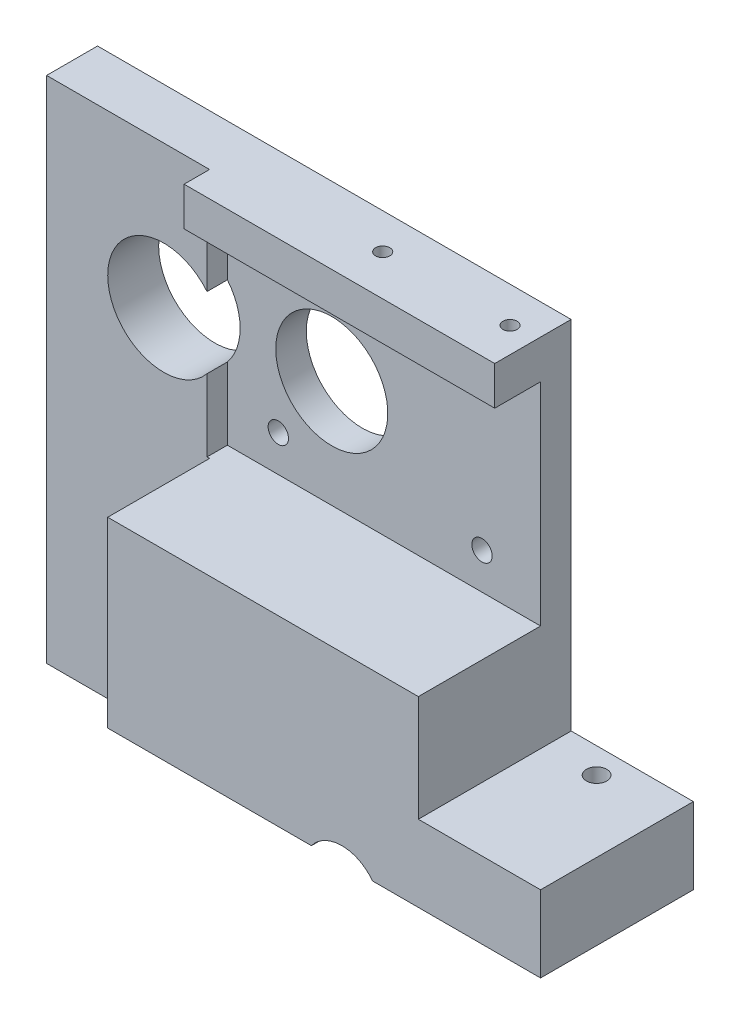
ISO-10303-21;
HEADER;
FILE_DESCRIPTION(('STEP AP214'),'2;1');
FILE_NAME('part.step','',(''),(''),'','','');
FILE_SCHEMA(('AUTOMOTIVE_DESIGN { 1 0 10303 214 1 1 1 1 }'));
ENDSEC;
DATA;
#1=APPLICATION_CONTEXT('core data for automotive mechanical design processes');
#2=APPLICATION_PROTOCOL_DEFINITION('international standard','automotive_design',2000,#1);
#3=PRODUCT_CONTEXT('',#1,'mechanical');
#4=PRODUCT('Part','Part','',(#3));
#5=PRODUCT_RELATED_PRODUCT_CATEGORY('part','',(#4));
#6=PRODUCT_DEFINITION_FORMATION('','',#4);
#7=PRODUCT_DEFINITION_CONTEXT('part definition',#1,'design');
#8=PRODUCT_DEFINITION('design','',#6,#7);
#9=PRODUCT_DEFINITION_SHAPE('','',#8);
#10=(LENGTH_UNIT() NAMED_UNIT(*) SI_UNIT(.MILLI.,.METRE.));
#11=(NAMED_UNIT(*) PLANE_ANGLE_UNIT() SI_UNIT($,.RADIAN.));
#12=(NAMED_UNIT(*) SI_UNIT($,.STERADIAN.) SOLID_ANGLE_UNIT());
#13=UNCERTAINTY_MEASURE_WITH_UNIT(LENGTH_MEASURE(1.E-05),#10,'distance_accuracy_value','');
#14=(GEOMETRIC_REPRESENTATION_CONTEXT(3) GLOBAL_UNCERTAINTY_ASSIGNED_CONTEXT((#13)) GLOBAL_UNIT_ASSIGNED_CONTEXT((#10,
#11,#12)) REPRESENTATION_CONTEXT('',''));
#15=CARTESIAN_POINT('',(0.,0.,0.));
#16=DIRECTION('',(0.,0.,1.));
#17=DIRECTION('',(1.,0.,0.));
#18=AXIS2_PLACEMENT_3D('',#15,#16,#17);
#19=CARTESIAN_POINT('',(40.8129496402878,-20.0719424460431,10.));
#20=DIRECTION('',(0.,1.,0.));
#21=DIRECTION('',(-1.,0.,0.));
#22=AXIS2_PLACEMENT_3D('',#19,#20,#21);
#23=PLANE('',#22);
#24=DIRECTION('',(0.,0.,1.));
#25=VECTOR('',#24,1.);
#26=CARTESIAN_POINT('',(-4.18705035971223,-20.0719424460432,-0.00999999999999959));
#27=LINE('',#26,#25);
#28=CARTESIAN_POINT('',(-4.18705035971223,-20.0719424460432,30.));
#29=VERTEX_POINT('',#28);
#30=CARTESIAN_POINT('',(-4.18705035971223,-20.0719424460432,10.));
#31=VERTEX_POINT('',#30);
#32=EDGE_CURVE('E185',#29,#31,#27,.F.);
#33=ORIENTED_EDGE('',*,*,#32,.F.);
#34=DIRECTION('',(1.,0.,0.));
#35=VECTOR('',#34,1.);
#36=CARTESIAN_POINT('',(0.,-20.0719424460432,30.));
#37=LINE('',#36,#35);
#38=CARTESIAN_POINT('',(-44.1870503597122,-20.0719424460432,30.));
#39=VERTEX_POINT('',#38);
#40=EDGE_CURVE('E195',#39,#29,#37,.T.);
#41=ORIENTED_EDGE('',*,*,#40,.F.);
#42=DIRECTION('',(0.,0.,-1.));
#43=VECTOR('',#42,1.);
#44=CARTESIAN_POINT('',(-44.1870503597122,-20.0719424460432,30.));
#45=LINE('',#44,#43);
#46=CARTESIAN_POINT('',(-44.1870503597122,-20.0719424460432,10.));
#47=VERTEX_POINT('',#46);
#48=EDGE_CURVE('E216',#39,#47,#45,.T.);
#49=ORIENTED_EDGE('',*,*,#48,.T.);
#50=DIRECTION('',(1.,0.,0.));
#51=VECTOR('',#50,1.);
#52=CARTESIAN_POINT('',(0.,-20.0719424460432,10.));
#53=LINE('',#52,#51);
#54=EDGE_CURVE('E197',#47,#31,#53,.T.);
#55=ORIENTED_EDGE('',*,*,#54,.T.);
#56=EDGE_LOOP('',(#33,#41,#49,#55));
#57=FACE_BOUND('',#56,.T.);
#58=ADVANCED_FACE('F35',(#57),#23,.F.);
#59=CARTESIAN_POINT('',(26.8129496402877,-20.0719424460431,5.));
#60=DIRECTION('',(0.,1.,0.));
#61=DIRECTION('',(-1.,0.,0.));
#62=AXIS2_PLACEMENT_3D('',#59,#60,#61);
#63=CIRCLE('',#62,2.);
#64=CARTESIAN_POINT('',(24.8129496402878,-20.0719424460431,5.));
#65=VERTEX_POINT('',#64);
#66=EDGE_CURVE('E286',#65,#65,#63,.T.);
#67=ORIENTED_EDGE('',*,*,#66,.T.);
#68=EDGE_LOOP('',(#67));
#69=FACE_BOUND('',#68,.T.);
#70=DIRECTION('',(0.,0.,1.));
#71=VECTOR('',#70,1.);
#72=CARTESIAN_POINT('',(7.81294964028777,-20.0719424460432,-0.00999999999999959));
#73=LINE('',#72,#71);
#74=CARTESIAN_POINT('',(7.81294964028777,-20.0719424460432,10.));
#75=VERTEX_POINT('',#74);
#76=CARTESIAN_POINT('',(7.81294964028777,-20.0719424460432,30.));
#77=VERTEX_POINT('',#76);
#78=EDGE_CURVE('E50',#75,#77,#73,.T.);
#79=ORIENTED_EDGE('',*,*,#78,.F.);
#80=CARTESIAN_POINT('',(16.8129496402878,-20.0719424460432,10.));
#81=VERTEX_POINT('',#80);
#82=EDGE_CURVE('E219',#75,#81,#53,.T.);
#83=ORIENTED_EDGE('',*,*,#82,.T.);
#84=DIRECTION('',(0.,0.,-1.));
#85=VECTOR('',#84,1.);
#86=CARTESIAN_POINT('',(16.8129496402878,-20.0719424460432,10.));
#87=LINE('',#86,#85);
#88=CARTESIAN_POINT('',(16.8129496402878,-20.0719424460432,0.));
#89=VERTEX_POINT('',#88);
#90=EDGE_CURVE('E298',#81,#89,#87,.T.);
#91=ORIENTED_EDGE('',*,*,#90,.T.);
#92=CARTESIAN_POINT('',(16.8129496402878,-20.0719424460432,-0.01));
#93=VERTEX_POINT('',#92);
#94=EDGE_CURVE('E289',#89,#93,#87,.T.);
#95=ORIENTED_EDGE('',*,*,#94,.T.);
#96=DIRECTION('',(-1.,0.,0.));
#97=VECTOR('',#96,1.);
#98=CARTESIAN_POINT('',(40.8129496402878,-20.0719424460431,-0.01));
#99=LINE('',#98,#97);
#100=CARTESIAN_POINT('',(40.8129496402878,-20.0719424460431,-0.01));
#101=VERTEX_POINT('',#100);
#102=EDGE_CURVE('E308',#101,#93,#99,.T.);
#103=ORIENTED_EDGE('',*,*,#102,.F.);
#104=DIRECTION('',(0.,0.,-1.));
#105=VECTOR('',#104,1.);
#106=CARTESIAN_POINT('',(40.8129496402878,-20.0719424460431,10.));
#107=LINE('',#106,#105);
#108=CARTESIAN_POINT('',(40.8129496402878,-20.0719424460431,30.));
#109=VERTEX_POINT('',#108);
#110=EDGE_CURVE('E290',#109,#101,#107,.T.);
#111=ORIENTED_EDGE('',*,*,#110,.F.);
#112=EDGE_CURVE('E206',#77,#109,#37,.T.);
#113=ORIENTED_EDGE('',*,*,#112,.F.);
#114=EDGE_LOOP('',(#79,#83,#91,#95,#103,#111,#113));
#115=FACE_BOUND('',#114,.T.);
#116=ADVANCED_FACE('F424',(#69,#115),#23,.F.);
#117=CARTESIAN_POINT('',(-44.6870503597123,15.7891322785426,6.));
#118=DIRECTION('',(-1.,0.,0.));
#119=DIRECTION('',(0.,0.,1.));
#120=AXIS2_PLACEMENT_3D('',#117,#118,#119);
#121=PLANE('',#120);
#122=DIRECTION('',(0.,-1.,0.));
#123=VECTOR('',#122,1.);
#124=CARTESIAN_POINT('',(-44.6870503597123,15.7891322785426,10.));
#125=LINE('',#124,#123);
#126=CARTESIAN_POINT('',(-44.6870503597123,57.7891322785426,10.));
#127=VERTEX_POINT('',#126);
#128=CARTESIAN_POINT('',(-44.6870503597123,43.9101775758413,10.));
#129=VERTEX_POINT('',#128);
#130=EDGE_CURVE('E264',#127,#129,#125,.T.);
#131=ORIENTED_EDGE('',*,*,#130,.T.);
#132=DIRECTION('',(0.,0.,-1.));
#133=VECTOR('',#132,1.);
#134=CARTESIAN_POINT('',(-44.6870503597123,43.9101775758413,15.));
#135=LINE('',#134,#133);
#136=CARTESIAN_POINT('',(-44.6870503597123,43.9101775758413,6.));
#137=VERTEX_POINT('',#136);
#138=EDGE_CURVE('E11',#129,#137,#135,.T.);
#139=ORIENTED_EDGE('',*,*,#138,.T.);
#140=DIRECTION('',(0.,-1.,0.));
#141=VECTOR('',#140,1.);
#142=CARTESIAN_POINT('',(-44.6870503597123,15.7891322785426,6.));
#143=LINE('',#142,#141);
#144=CARTESIAN_POINT('',(-44.6870503597123,57.7891322785426,6.));
#145=VERTEX_POINT('',#144);
#146=EDGE_CURVE('E251',#145,#137,#143,.T.);
#147=ORIENTED_EDGE('',*,*,#146,.F.);
#148=DIRECTION('',(0.,0.,1.));
#149=VECTOR('',#148,1.);
#150=CARTESIAN_POINT('',(-44.6870503597123,57.7891322785426,6.));
#151=LINE('',#150,#149);
#152=EDGE_CURVE('E272',#145,#127,#151,.T.);
#153=ORIENTED_EDGE('',*,*,#152,.T.);
#154=EDGE_LOOP('',(#131,#139,#147,#153));
#155=FACE_BOUND('',#154,.T.);
#156=ADVANCED_FACE('F390',(#155),#121,.F.);
#157=CARTESIAN_POINT('',(0.,0.,10.));
#158=DIRECTION('',(0.,0.,1.));
#159=DIRECTION('',(1.,0.,0.));
#160=AXIS2_PLACEMENT_3D('',#157,#158,#159);
#161=PLANE('',#160);
#162=ORIENTED_EDGE('',*,*,#82,.F.);
#163=CARTESIAN_POINT('',(1.81294964028777,-24.5719424460432,10.));
#164=DIRECTION('',(0.,0.,1.));
#165=DIRECTION('',(1.,0.,0.));
#166=AXIS2_PLACEMENT_3D('',#163,#164,#165);
#167=CIRCLE('',#166,7.5);
#168=EDGE_CURVE('E199',#75,#31,#167,.F.);
#169=ORIENTED_EDGE('',*,*,#168,.T.);
#170=ORIENTED_EDGE('',*,*,#54,.F.);
#171=DIRECTION('',(0.,-1.,0.));
#172=VECTOR('',#171,1.);
#173=CARTESIAN_POINT('',(-44.1870503597122,0.,10.));
#174=LINE('',#173,#172);
#175=CARTESIAN_POINT('',(-44.1870503597122,15.7891322785426,10.));
#176=VERTEX_POINT('',#175);
#177=EDGE_CURVE('E217',#176,#47,#174,.T.);
#178=ORIENTED_EDGE('',*,*,#177,.F.);
#179=DIRECTION('',(1.,0.,0.));
#180=VECTOR('',#179,1.);
#181=CARTESIAN_POINT('',(-44.6870503597123,15.7891322785426,10.));
#182=LINE('',#181,#180);
#183=CARTESIAN_POINT('',(-44.6870503597123,15.7891322785426,10.));
#184=VERTEX_POINT('',#183);
#185=EDGE_CURVE('E267',#184,#176,#182,.T.);
#186=ORIENTED_EDGE('',*,*,#185,.F.);
#187=CARTESIAN_POINT('',(-44.6870503597123,29.9459375320724,10.));
#188=VERTEX_POINT('',#187);
#189=EDGE_CURVE('E250',#188,#184,#125,.T.);
#190=ORIENTED_EDGE('',*,*,#189,.F.);
#191=CARTESIAN_POINT('',(-53.1870503597122,36.9280575539568,10.));
#192=DIRECTION('',(0.,0.,1.));
#193=DIRECTION('',(1.,0.,0.));
#194=AXIS2_PLACEMENT_3D('',#191,#192,#193);
#195=CIRCLE('',#194,11.);
#196=EDGE_CURVE('E58',#129,#188,#195,.T.);
#197=ORIENTED_EDGE('',*,*,#196,.F.);
#198=ORIENTED_EDGE('',*,*,#130,.F.);
#199=DIRECTION('',(-1.,0.,0.));
#200=VECTOR('',#199,1.);
#201=CARTESIAN_POINT('',(-44.6870503597123,57.7891322785426,10.));
#202=LINE('',#201,#200);
#203=CARTESIAN_POINT('',(-44.1870503597122,57.7891322785426,10.));
#204=VERTEX_POINT('',#203);
#205=EDGE_CURVE('E270',#204,#127,#202,.T.);
#206=ORIENTED_EDGE('',*,*,#205,.F.);
#207=DIRECTION('',(0.,-1.,0.));
#208=VECTOR('',#207,1.);
#209=CARTESIAN_POINT('',(-44.1870503597122,0.,10.));
#210=LINE('',#209,#208);
#211=CARTESIAN_POINT('',(-44.1870503597122,64.9280575539568,10.));
#212=VERTEX_POINT('',#211);
#213=EDGE_CURVE('E248',#212,#204,#210,.T.);
#214=ORIENTED_EDGE('',*,*,#213,.F.);
#215=DIRECTION('',(1.,0.,0.));
#216=VECTOR('',#215,1.);
#217=CARTESIAN_POINT('',(-76.1870503597122,64.9280575539568,10.));
#218=LINE('',#217,#216);
#219=CARTESIAN_POINT('',(-76.1870503597122,64.9280575539568,10.));
#220=VERTEX_POINT('',#219);
#221=EDGE_CURVE('E321',#220,#212,#218,.T.);
#222=ORIENTED_EDGE('',*,*,#221,.F.);
#223=DIRECTION('',(0.,-1.,0.));
#224=VECTOR('',#223,1.);
#225=CARTESIAN_POINT('',(-76.1870503597122,64.9280575539568,10.));
#226=LINE('',#225,#224);
#227=CARTESIAN_POINT('',(-76.1870503597122,-35.0719424460432,10.));
#228=VERTEX_POINT('',#227);
#229=EDGE_CURVE('E312',#220,#228,#226,.T.);
#230=ORIENTED_EDGE('',*,*,#229,.T.);
#231=DIRECTION('',(1.,0.,0.));
#232=VECTOR('',#231,1.);
#233=CARTESIAN_POINT('',(-76.1870503597122,-35.0719424460432,10.));
#234=LINE('',#233,#232);
#235=CARTESIAN_POINT('',(16.8129496402878,-35.0719424460432,10.));
#236=VERTEX_POINT('',#235);
#237=EDGE_CURVE('E315',#228,#236,#234,.T.);
#238=ORIENTED_EDGE('',*,*,#237,.T.);
#239=DIRECTION('',(0.,-1.,0.));
#240=VECTOR('',#239,1.);
#241=CARTESIAN_POINT('',(16.8129496402878,64.9280575539568,10.));
#242=LINE('',#241,#240);
#243=EDGE_CURVE('E319',#81,#236,#242,.T.);
#244=ORIENTED_EDGE('',*,*,#243,.F.);
#245=EDGE_LOOP('',(#162,#169,#170,#178,#186,#190,#197,#198,#206,#214,#222,#230,#238,#244));
#246=FACE_BOUND('',#245,.T.);
#247=ADVANCED_FACE('F359',(#246),#161,.T.);
#248=CARTESIAN_POINT('',(16.8129496402878,64.9280575539568,10.));
#249=DIRECTION('',(1.,0.,0.));
#250=DIRECTION('',(0.,1.,0.));
#251=AXIS2_PLACEMENT_3D('',#248,#249,#250);
#252=PLANE('',#251);
#253=DIRECTION('',(0.,-1.,0.));
#254=VECTOR('',#253,1.);
#255=CARTESIAN_POINT('',(16.8129496402878,64.9280575539568,0.));
#256=LINE('',#255,#254);
#257=CARTESIAN_POINT('',(16.8129496402878,64.9280575539568,0.));
#258=VERTEX_POINT('',#257);
#259=CARTESIAN_POINT('',(16.8129496402878,-5.07194244604316,0.));
#260=VERTEX_POINT('',#259);
#261=EDGE_CURVE('E331',#258,#260,#256,.T.);
#262=ORIENTED_EDGE('',*,*,#261,.F.);
#263=DIRECTION('',(0.,0.,-1.));
#264=VECTOR('',#263,1.);
#265=CARTESIAN_POINT('',(16.8129496402878,64.9280575539568,10.));
#266=LINE('',#265,#264);
#267=CARTESIAN_POINT('',(16.8129496402878,64.9280575539568,15.));
#268=VERTEX_POINT('',#267);
#269=EDGE_CURVE('E338',#268,#258,#266,.T.);
#270=ORIENTED_EDGE('',*,*,#269,.F.);
#271=DIRECTION('',(0.,1.,0.));
#272=VECTOR('',#271,1.);
#273=CARTESIAN_POINT('',(16.8129496402878,57.3280575539568,15.));
#274=LINE('',#273,#272);
#275=CARTESIAN_POINT('',(16.8129496402878,57.3280575539568,15.));
#276=VERTEX_POINT('',#275);
#277=EDGE_CURVE('E231',#276,#268,#274,.T.);
#278=ORIENTED_EDGE('',*,*,#277,.F.);
#279=DIRECTION('',(0.,0.,1.));
#280=VECTOR('',#279,1.);
#281=CARTESIAN_POINT('',(16.8129496402878,57.3280575539568,-55.4716194678487));
#282=LINE('',#281,#280);
#283=CARTESIAN_POINT('',(16.8129496402878,57.3280575539568,6.));
#284=VERTEX_POINT('',#283);
#285=EDGE_CURVE('E240',#284,#276,#282,.T.);
#286=ORIENTED_EDGE('',*,*,#285,.F.);
#287=DIRECTION('',(0.,1.,0.));
#288=VECTOR('',#287,1.);
#289=CARTESIAN_POINT('',(16.8129496402878,15.7891322785426,6.));
#290=LINE('',#289,#288);
#291=CARTESIAN_POINT('',(16.8129496402878,15.7891322785426,6.));
#292=VERTEX_POINT('',#291);
#293=EDGE_CURVE('E258',#292,#284,#290,.T.);
#294=ORIENTED_EDGE('',*,*,#293,.F.);
#295=DIRECTION('',(0.,0.,1.));
#296=VECTOR('',#295,1.);
#297=CARTESIAN_POINT('',(16.8129496402878,15.7891322785426,6.));
#298=LINE('',#297,#296);
#299=CARTESIAN_POINT('',(16.8129496402878,15.7891322785426,30.));
#300=VERTEX_POINT('',#299);
#301=EDGE_CURVE('E276',#292,#300,#298,.T.);
#302=ORIENTED_EDGE('',*,*,#301,.T.);
#303=DIRECTION('',(0.,-1.,0.));
#304=VECTOR('',#303,1.);
#305=CARTESIAN_POINT('',(16.8129496402878,0.,30.));
#306=LINE('',#305,#304);
#307=CARTESIAN_POINT('',(16.8129496402878,-5.07194244604316,30.));
#308=VERTEX_POINT('',#307);
#309=EDGE_CURVE('E221',#300,#308,#306,.T.);
#310=ORIENTED_EDGE('',*,*,#309,.T.);
#311=DIRECTION('',(0.,0.,1.));
#312=VECTOR('',#311,1.);
#313=CARTESIAN_POINT('',(16.8129496402878,-5.07194244604315,10.));
#314=LINE('',#313,#312);
#315=EDGE_CURVE('E305',#260,#308,#314,.T.);
#316=ORIENTED_EDGE('',*,*,#315,.F.);
#317=EDGE_LOOP('',(#262,#270,#278,#286,#294,#302,#310,#316));
#318=FACE_BOUND('',#317,.T.);
#319=ADVANCED_FACE('F374',(#318),#252,.T.);
#320=CARTESIAN_POINT('',(-76.1870503597122,64.9280575539568,10.));
#321=DIRECTION('',(1.,0.,0.));
#322=DIRECTION('',(0.,0.,-1.));
#323=AXIS2_PLACEMENT_3D('',#320,#321,#322);
#324=PLANE('',#323);
#325=DIRECTION('',(0.,-1.,0.));
#326=VECTOR('',#325,1.);
#327=CARTESIAN_POINT('',(-76.1870503597122,64.9280575539568,0.));
#328=LINE('',#327,#326);
#329=CARTESIAN_POINT('',(-76.1870503597122,64.9280575539568,0.));
#330=VERTEX_POINT('',#329);
#331=CARTESIAN_POINT('',(-76.1870503597122,-35.0719424460432,0.));
#332=VERTEX_POINT('',#331);
#333=EDGE_CURVE('E311',#330,#332,#328,.T.);
#334=ORIENTED_EDGE('',*,*,#333,.T.);
#335=DIRECTION('',(0.,0.,-1.));
#336=VECTOR('',#335,1.);
#337=CARTESIAN_POINT('',(-76.1870503597122,-35.0719424460432,10.));
#338=LINE('',#337,#336);
#339=EDGE_CURVE('E343',#228,#332,#338,.T.);
#340=ORIENTED_EDGE('',*,*,#339,.F.);
#341=ORIENTED_EDGE('',*,*,#229,.F.);
#342=DIRECTION('',(0.,0.,-1.));
#343=VECTOR('',#342,1.);
#344=CARTESIAN_POINT('',(-76.1870503597122,64.9280575539568,10.));
#345=LINE('',#344,#343);
#346=EDGE_CURVE('E324',#220,#330,#345,.T.);
#347=ORIENTED_EDGE('',*,*,#346,.T.);
#348=EDGE_LOOP('',(#334,#340,#341,#347));
#349=FACE_BOUND('',#348,.T.);
#350=ADVANCED_FACE('F37',(#349),#324,.F.);
#351=CARTESIAN_POINT('',(-76.1870503597122,-35.0719424460432,10.));
#352=DIRECTION('',(0.,1.,0.));
#353=DIRECTION('',(0.,0.,1.));
#354=AXIS2_PLACEMENT_3D('',#351,#352,#353);
#355=PLANE('',#354);
#356=DIRECTION('',(1.,0.,0.));
#357=VECTOR('',#356,1.);
#358=CARTESIAN_POINT('',(-76.1870503597122,-35.0719424460432,0.));
#359=LINE('',#358,#357);
#360=CARTESIAN_POINT('',(16.8129496402878,-35.0719424460432,0.));
#361=VERTEX_POINT('',#360);
#362=EDGE_CURVE('E327',#332,#361,#359,.T.);
#363=ORIENTED_EDGE('',*,*,#362,.T.);
#364=DIRECTION('',(0.,0.,-1.));
#365=VECTOR('',#364,1.);
#366=CARTESIAN_POINT('',(16.8129496402878,-35.0719424460432,10.));
#367=LINE('',#366,#365);
#368=EDGE_CURVE('E340',#236,#361,#367,.T.);
#369=ORIENTED_EDGE('',*,*,#368,.F.);
#370=ORIENTED_EDGE('',*,*,#237,.F.);
#371=ORIENTED_EDGE('',*,*,#339,.T.);
#372=EDGE_LOOP('',(#363,#369,#370,#371));
#373=FACE_BOUND('',#372,.T.);
#374=ADVANCED_FACE('F435',(#373),#355,.F.);
#375=ORIENTED_EDGE('',*,*,#90,.F.);
#376=ORIENTED_EDGE('',*,*,#243,.T.);
#377=ORIENTED_EDGE('',*,*,#368,.T.);
#378=EDGE_CURVE('E330',#89,#361,#256,.T.);
#379=ORIENTED_EDGE('',*,*,#378,.F.);
#380=EDGE_LOOP('',(#375,#376,#377,#379));
#381=FACE_BOUND('',#380,.T.);
#382=ADVANCED_FACE('F429',(#381),#252,.T.);
#383=CARTESIAN_POINT('',(-76.1870503597122,64.9280575539568,10.));
#384=DIRECTION('',(0.,1.,0.));
#385=DIRECTION('',(0.,0.,1.));
#386=AXIS2_PLACEMENT_3D('',#383,#384,#385);
#387=PLANE('',#386);
#388=CARTESIAN_POINT('',(-13.1870503597122,64.9280575539568,7.));
#389=DIRECTION('',(0.,1.,0.));
#390=DIRECTION('',(0.,0.,1.));
#391=AXIS2_PLACEMENT_3D('',#388,#389,#390);
#392=CIRCLE('',#391,1.4);
#393=CARTESIAN_POINT('',(-13.1870503597122,64.9280575539568,8.4));
#394=VERTEX_POINT('',#393);
#395=EDGE_CURVE('E791',#394,#394,#392,.T.);
#396=ORIENTED_EDGE('',*,*,#395,.F.);
#397=EDGE_LOOP('',(#396));
#398=FACE_BOUND('',#397,.T.);
#399=CARTESIAN_POINT('',(11.8129496402878,64.9280575539568,7.));
#400=DIRECTION('',(0.,1.,0.));
#401=DIRECTION('',(0.,0.,1.));
#402=AXIS2_PLACEMENT_3D('',#399,#400,#401);
#403=CIRCLE('',#402,1.4);
#404=CARTESIAN_POINT('',(11.8129496402878,64.9280575539568,8.4));
#405=VERTEX_POINT('',#404);
#406=EDGE_CURVE('E794',#405,#405,#403,.T.);
#407=ORIENTED_EDGE('',*,*,#406,.F.);
#408=EDGE_LOOP('',(#407));
#409=FACE_BOUND('',#408,.T.);
#410=ORIENTED_EDGE('',*,*,#269,.T.);
#411=DIRECTION('',(1.,0.,0.));
#412=VECTOR('',#411,1.);
#413=CARTESIAN_POINT('',(-76.1870503597122,64.9280575539568,0.));
#414=LINE('',#413,#412);
#415=EDGE_CURVE('E316',#330,#258,#414,.T.);
#416=ORIENTED_EDGE('',*,*,#415,.F.);
#417=ORIENTED_EDGE('',*,*,#346,.F.);
#418=ORIENTED_EDGE('',*,*,#221,.T.);
#419=DIRECTION('',(0.,0.,1.));
#420=VECTOR('',#419,1.);
#421=CARTESIAN_POINT('',(-44.1870503597122,64.9280575539568,-55.4716194678487));
#422=LINE('',#421,#420);
#423=CARTESIAN_POINT('',(-44.1870503597122,64.9280575539568,15.));
#424=VERTEX_POINT('',#423);
#425=EDGE_CURVE('E244',#212,#424,#422,.T.);
#426=ORIENTED_EDGE('',*,*,#425,.T.);
#427=DIRECTION('',(-1.,0.,0.));
#428=VECTOR('',#427,1.);
#429=CARTESIAN_POINT('',(-44.1870503597122,64.9280575539568,15.));
#430=LINE('',#429,#428);
#431=EDGE_CURVE('E234',#268,#424,#430,.T.);
#432=ORIENTED_EDGE('',*,*,#431,.F.);
#433=EDGE_LOOP('',(#410,#416,#417,#418,#426,#432));
#434=FACE_BOUND('',#433,.T.);
#435=ADVANCED_FACE('F438',(#398,#409,#434),#387,.T.);
#436=CARTESIAN_POINT('',(0.,0.,0.));
#437=DIRECTION('',(0.,0.,1.));
#438=DIRECTION('',(1.,0.,0.));
#439=AXIS2_PLACEMENT_3D('',#436,#437,#438);
#440=PLANE('',#439);
#441=CARTESIAN_POINT('',(1.81294964028777,-24.5719424460432,0.));
#442=DIRECTION('',(0.,0.,1.));
#443=DIRECTION('',(1.,0.,0.));
#444=AXIS2_PLACEMENT_3D('',#441,#442,#443);
#445=CIRCLE('',#444,7.5);
#446=CARTESIAN_POINT('',(9.31294964028777,-24.5719424460432,0.));
#447=VERTEX_POINT('',#446);
#448=EDGE_CURVE('E198',#447,#447,#445,.F.);
#449=ORIENTED_EDGE('',*,*,#448,.F.);
#450=EDGE_LOOP('',(#449));
#451=FACE_BOUND('',#450,.T.);
#452=CARTESIAN_POINT('',(5.31294964028775,50.9280575539568,0.));
#453=DIRECTION('',(0.,0.,1.));
#454=DIRECTION('',(1.,0.,0.));
#455=AXIS2_PLACEMENT_3D('',#452,#453,#454);
#456=CIRCLE('',#455,2.);
#457=CARTESIAN_POINT('',(7.31294964028775,50.9280575539568,0.));
#458=VERTEX_POINT('',#457);
#459=EDGE_CURVE('E396',#458,#458,#456,.T.);
#460=ORIENTED_EDGE('',*,*,#459,.T.);
#461=EDGE_LOOP('',(#460));
#462=FACE_BOUND('',#461,.T.);
#463=CARTESIAN_POINT('',(-34.6870503597123,22.9280575539568,0.));
#464=DIRECTION('',(0.,0.,1.));
#465=DIRECTION('',(1.,0.,0.));
#466=AXIS2_PLACEMENT_3D('',#463,#464,#465);
#467=CIRCLE('',#466,2.);
#468=CARTESIAN_POINT('',(-32.6870503597122,22.9280575539568,0.));
#469=VERTEX_POINT('',#468);
#470=EDGE_CURVE('E816',#469,#469,#467,.T.);
#471=ORIENTED_EDGE('',*,*,#470,.T.);
#472=EDGE_LOOP('',(#471));
#473=FACE_BOUND('',#472,.T.);
#474=CARTESIAN_POINT('',(5.31294964028775,22.9280575539568,0.));
#475=DIRECTION('',(0.,0.,1.));
#476=DIRECTION('',(1.,0.,0.));
#477=AXIS2_PLACEMENT_3D('',#474,#475,#476);
#478=CIRCLE('',#477,2.);
#479=CARTESIAN_POINT('',(7.31294964028775,22.9280575539568,0.));
#480=VERTEX_POINT('',#479);
#481=EDGE_CURVE('E813',#480,#480,#478,.T.);
#482=ORIENTED_EDGE('',*,*,#481,.T.);
#483=EDGE_LOOP('',(#482));
#484=FACE_BOUND('',#483,.T.);
#485=CARTESIAN_POINT('',(-34.6870503597123,50.9280575539568,0.));
#486=DIRECTION('',(0.,0.,1.));
#487=DIRECTION('',(1.,0.,0.));
#488=AXIS2_PLACEMENT_3D('',#485,#486,#487);
#489=CIRCLE('',#488,2.);
#490=CARTESIAN_POINT('',(-32.6870503597122,50.9280575539568,0.));
#491=VERTEX_POINT('',#490);
#492=EDGE_CURVE('E810',#491,#491,#489,.T.);
#493=ORIENTED_EDGE('',*,*,#492,.T.);
#494=EDGE_LOOP('',(#493));
#495=FACE_BOUND('',#494,.T.);
#496=CARTESIAN_POINT('',(-53.1870503597122,36.9280575539568,0.));
#497=DIRECTION('',(0.,0.,-1.));
#498=DIRECTION('',(-1.,0.,0.));
#499=AXIS2_PLACEMENT_3D('',#496,#497,#498);
#500=CIRCLE('',#499,11.);
#501=CARTESIAN_POINT('',(-64.1870503597122,36.9280575539568,0.));
#502=VERTEX_POINT('',#501);
#503=EDGE_CURVE('E392',#502,#502,#500,.T.);
#504=ORIENTED_EDGE('',*,*,#503,.F.);
#505=EDGE_LOOP('',(#504));
#506=FACE_BOUND('',#505,.T.);
#507=CARTESIAN_POINT('',(-24.1870503597122,36.9280575539568,0.));
#508=DIRECTION('',(0.,0.,-1.));
#509=DIRECTION('',(-1.,0.,0.));
#510=AXIS2_PLACEMENT_3D('',#507,#508,#509);
#511=CIRCLE('',#510,11.);
#512=CARTESIAN_POINT('',(-35.1870503597122,36.9280575539568,0.));
#513=VERTEX_POINT('',#512);
#514=EDGE_CURVE('E280',#513,#513,#511,.T.);
#515=ORIENTED_EDGE('',*,*,#514,.F.);
#516=EDGE_LOOP('',(#515));
#517=FACE_BOUND('',#516,.T.);
#518=ORIENTED_EDGE('',*,*,#333,.F.);
#519=ORIENTED_EDGE('',*,*,#415,.T.);
#520=ORIENTED_EDGE('',*,*,#261,.T.);
#521=EDGE_CURVE('E334',#260,#89,#256,.T.);
#522=ORIENTED_EDGE('',*,*,#521,.T.);
#523=ORIENTED_EDGE('',*,*,#378,.T.);
#524=ORIENTED_EDGE('',*,*,#362,.F.);
#525=EDGE_LOOP('',(#518,#519,#520,#522,#523,#524));
#526=FACE_BOUND('',#525,.T.);
#527=ADVANCED_FACE('F407',(#451,#462,#473,#484,#495,#506,#517,#526),#440,.F.);
#528=CARTESIAN_POINT('',(40.8129496402878,-5.07194244604315,-0.01));
#529=DIRECTION('',(0.,0.,1.));
#530=DIRECTION('',(1.,0.,0.));
#531=AXIS2_PLACEMENT_3D('',#528,#529,#530);
#532=PLANE('',#531);
#533=DIRECTION('',(0.,1.,0.));
#534=VECTOR('',#533,1.);
#535=CARTESIAN_POINT('',(16.8129496402878,-5.07194244604315,-0.01));
#536=LINE('',#535,#534);
#537=CARTESIAN_POINT('',(16.8129496402878,-5.07194244604315,-0.01));
#538=VERTEX_POINT('',#537);
#539=EDGE_CURVE('E301',#93,#538,#536,.T.);
#540=ORIENTED_EDGE('',*,*,#539,.T.);
#541=DIRECTION('',(-1.,0.,0.));
#542=VECTOR('',#541,1.);
#543=CARTESIAN_POINT('',(40.8129496402878,-5.07194244604315,-0.01));
#544=LINE('',#543,#542);
#545=CARTESIAN_POINT('',(40.8129496402878,-5.07194244604315,-0.01));
#546=VERTEX_POINT('',#545);
#547=EDGE_CURVE('E297',#546,#538,#544,.T.);
#548=ORIENTED_EDGE('',*,*,#547,.F.);
#549=DIRECTION('',(0.,1.,0.));
#550=VECTOR('',#549,1.);
#551=CARTESIAN_POINT('',(40.8129496402878,-5.07194244604315,-0.01));
#552=LINE('',#551,#550);
#553=EDGE_CURVE('E292',#101,#546,#552,.T.);
#554=ORIENTED_EDGE('',*,*,#553,.F.);
#555=ORIENTED_EDGE('',*,*,#102,.T.);
#556=EDGE_LOOP('',(#540,#548,#554,#555));
#557=FACE_BOUND('',#556,.T.);
#558=ADVANCED_FACE('F420',(#557),#532,.F.);
#559=CARTESIAN_POINT('',(40.8129496402878,-5.07194244604315,10.));
#560=DIRECTION('',(0.,-1.,0.));
#561=DIRECTION('',(1.,0.,0.));
#562=AXIS2_PLACEMENT_3D('',#559,#560,#561);
#563=PLANE('',#562);
#564=CARTESIAN_POINT('',(26.8129496402877,-5.07194244604316,5.));
#565=DIRECTION('',(0.,1.,0.));
#566=DIRECTION('',(-1.,0.,0.));
#567=AXIS2_PLACEMENT_3D('',#564,#565,#566);
#568=CIRCLE('',#567,2.);
#569=CARTESIAN_POINT('',(24.8129496402878,-5.07194244604316,5.));
#570=VERTEX_POINT('',#569);
#571=EDGE_CURVE('E283',#570,#570,#568,.T.);
#572=ORIENTED_EDGE('',*,*,#571,.F.);
#573=EDGE_LOOP('',(#572));
#574=FACE_BOUND('',#573,.T.);
#575=EDGE_CURVE('E293',#538,#260,#314,.T.);
#576=ORIENTED_EDGE('',*,*,#575,.T.);
#577=ORIENTED_EDGE('',*,*,#315,.T.);
#578=DIRECTION('',(-1.,0.,0.));
#579=VECTOR('',#578,1.);
#580=CARTESIAN_POINT('',(0.,-5.07194244604316,30.));
#581=LINE('',#580,#579);
#582=CARTESIAN_POINT('',(40.8129496402878,-5.07194244604315,30.));
#583=VERTEX_POINT('',#582);
#584=EDGE_CURVE('E209',#583,#308,#581,.T.);
#585=ORIENTED_EDGE('',*,*,#584,.F.);
#586=DIRECTION('',(0.,0.,1.));
#587=VECTOR('',#586,1.);
#588=CARTESIAN_POINT('',(40.8129496402878,-5.07194244604315,10.));
#589=LINE('',#588,#587);
#590=EDGE_CURVE('E295',#546,#583,#589,.T.);
#591=ORIENTED_EDGE('',*,*,#590,.F.);
#592=ORIENTED_EDGE('',*,*,#547,.T.);
#593=EDGE_LOOP('',(#576,#577,#585,#591,#592));
#594=FACE_BOUND('',#593,.T.);
#595=ADVANCED_FACE('F415',(#574,#594),#563,.F.);
#596=CARTESIAN_POINT('',(40.8129496402878,0.,0.));
#597=DIRECTION('',(1.,0.,0.));
#598=DIRECTION('',(0.,1.,0.));
#599=AXIS2_PLACEMENT_3D('',#596,#597,#598);
#600=PLANE('',#599);
#601=ORIENTED_EDGE('',*,*,#590,.T.);
#602=DIRECTION('',(0.,1.,0.));
#603=VECTOR('',#602,1.);
#604=CARTESIAN_POINT('',(40.8129496402878,0.,30.));
#605=LINE('',#604,#603);
#606=EDGE_CURVE('E205',#109,#583,#605,.T.);
#607=ORIENTED_EDGE('',*,*,#606,.F.);
#608=ORIENTED_EDGE('',*,*,#110,.T.);
#609=ORIENTED_EDGE('',*,*,#553,.T.);
#610=EDGE_LOOP('',(#601,#607,#608,#609));
#611=FACE_BOUND('',#610,.T.);
#612=ADVANCED_FACE('F697',(#611),#600,.T.);
#613=CARTESIAN_POINT('',(16.8129496402878,0.,0.));
#614=DIRECTION('',(1.,0.,0.));
#615=DIRECTION('',(0.,1.,0.));
#616=AXIS2_PLACEMENT_3D('',#613,#614,#615);
#617=PLANE('',#616);
#618=ORIENTED_EDGE('',*,*,#521,.F.);
#619=ORIENTED_EDGE('',*,*,#575,.F.);
#620=ORIENTED_EDGE('',*,*,#539,.F.);
#621=ORIENTED_EDGE('',*,*,#94,.F.);
#622=EDGE_LOOP('',(#618,#619,#620,#621));
#623=FACE_BOUND('',#622,.T.);
#624=ADVANCED_FACE('F413',(#623),#617,.F.);
#625=CARTESIAN_POINT('',(26.8129496402878,-55.0719424460432,5.));
#626=DIRECTION('',(0.,1.,0.));
#627=DIRECTION('',(-1.,0.,0.));
#628=AXIS2_PLACEMENT_3D('',#625,#626,#627);
#629=CYLINDRICAL_SURFACE('',#628,2.);
#630=ORIENTED_EDGE('',*,*,#571,.T.);
#631=EDGE_LOOP('',(#630));
#632=FACE_BOUND('',#631,.T.);
#633=ORIENTED_EDGE('',*,*,#66,.F.);
#634=EDGE_LOOP('',(#633));
#635=FACE_BOUND('',#634,.T.);
#636=ADVANCED_FACE('F709',(#632,#635),#629,.F.);
#637=CARTESIAN_POINT('',(-24.1870503597122,36.9280575539568,50.));
#638=DIRECTION('',(0.,0.,-1.));
#639=DIRECTION('',(-1.,0.,0.));
#640=AXIS2_PLACEMENT_3D('',#637,#638,#639);
#641=CYLINDRICAL_SURFACE('',#640,11.);
#642=CARTESIAN_POINT('',(-24.1870503597122,36.9280575539568,6.));
#643=DIRECTION('',(0.,0.,-1.));
#644=DIRECTION('',(-1.,0.,0.));
#645=AXIS2_PLACEMENT_3D('',#642,#643,#644);
#646=CIRCLE('',#645,11.);
#647=CARTESIAN_POINT('',(-35.1870503597122,36.9280575539568,6.));
#648=VERTEX_POINT('',#647);
#649=EDGE_CURVE('E275',#648,#648,#646,.F.);
#650=ORIENTED_EDGE('',*,*,#649,.T.);
#651=EDGE_LOOP('',(#650));
#652=FACE_BOUND('',#651,.T.);
#653=ORIENTED_EDGE('',*,*,#514,.T.);
#654=EDGE_LOOP('',(#653));
#655=FACE_BOUND('',#654,.T.);
#656=ADVANCED_FACE('F611',(#652,#655),#641,.F.);
#657=CARTESIAN_POINT('',(0.,0.,6.));
#658=DIRECTION('',(0.,0.,-1.));
#659=DIRECTION('',(-1.,0.,0.));
#660=AXIS2_PLACEMENT_3D('',#657,#658,#659);
#661=PLANE('',#660);
#662=CARTESIAN_POINT('',(5.31294964028775,50.9280575539568,6.));
#663=DIRECTION('',(0.,0.,1.));
#664=DIRECTION('',(1.,0.,0.));
#665=AXIS2_PLACEMENT_3D('',#662,#663,#664);
#666=CIRCLE('',#665,2.);
#667=CARTESIAN_POINT('',(7.31294964028775,50.9280575539568,6.));
#668=VERTEX_POINT('',#667);
#669=EDGE_CURVE('E802',#668,#668,#666,.T.);
#670=ORIENTED_EDGE('',*,*,#669,.F.);
#671=EDGE_LOOP('',(#670));
#672=FACE_BOUND('',#671,.T.);
#673=CARTESIAN_POINT('',(-34.6870503597123,22.9280575539568,6.));
#674=DIRECTION('',(0.,0.,1.));
#675=DIRECTION('',(1.,0.,0.));
#676=AXIS2_PLACEMENT_3D('',#673,#674,#675);
#677=CIRCLE('',#676,2.);
#678=CARTESIAN_POINT('',(-32.6870503597122,22.9280575539568,6.));
#679=VERTEX_POINT('',#678);
#680=EDGE_CURVE('E801',#679,#679,#677,.T.);
#681=ORIENTED_EDGE('',*,*,#680,.F.);
#682=EDGE_LOOP('',(#681));
#683=FACE_BOUND('',#682,.T.);
#684=CARTESIAN_POINT('',(5.31294964028775,22.9280575539568,6.));
#685=DIRECTION('',(0.,0.,1.));
#686=DIRECTION('',(1.,0.,0.));
#687=AXIS2_PLACEMENT_3D('',#684,#685,#686);
#688=CIRCLE('',#687,2.);
#689=CARTESIAN_POINT('',(7.31294964028775,22.9280575539568,6.));
#690=VERTEX_POINT('',#689);
#691=EDGE_CURVE('E790',#690,#690,#688,.T.);
#692=ORIENTED_EDGE('',*,*,#691,.F.);
#693=EDGE_LOOP('',(#692));
#694=FACE_BOUND('',#693,.T.);
#695=CARTESIAN_POINT('',(-34.6870503597123,50.9280575539568,6.));
#696=DIRECTION('',(0.,0.,1.));
#697=DIRECTION('',(1.,0.,0.));
#698=AXIS2_PLACEMENT_3D('',#695,#696,#697);
#699=CIRCLE('',#698,2.);
#700=CARTESIAN_POINT('',(-32.6870503597122,50.9280575539568,6.));
#701=VERTEX_POINT('',#700);
#702=EDGE_CURVE('E805',#701,#701,#699,.T.);
#703=ORIENTED_EDGE('',*,*,#702,.F.);
#704=EDGE_LOOP('',(#703));
#705=FACE_BOUND('',#704,.T.);
#706=ORIENTED_EDGE('',*,*,#146,.T.);
#707=CARTESIAN_POINT('',(-53.1870503597122,36.9280575539568,6.));
#708=DIRECTION('',(0.,0.,-1.));
#709=DIRECTION('',(-1.,0.,0.));
#710=AXIS2_PLACEMENT_3D('',#707,#708,#709);
#711=CIRCLE('',#710,11.);
#712=CARTESIAN_POINT('',(-44.6870503597123,29.9459375320724,6.));
#713=VERTEX_POINT('',#712);
#714=EDGE_CURVE('E391',#137,#713,#711,.T.);
#715=ORIENTED_EDGE('',*,*,#714,.T.);
#716=CARTESIAN_POINT('',(-44.6870503597123,15.7891322785426,6.));
#717=VERTEX_POINT('',#716);
#718=EDGE_CURVE('E255',#713,#717,#143,.T.);
#719=ORIENTED_EDGE('',*,*,#718,.T.);
#720=DIRECTION('',(1.,0.,0.));
#721=VECTOR('',#720,1.);
#722=CARTESIAN_POINT('',(-44.6870503597123,15.7891322785426,6.));
#723=LINE('',#722,#721);
#724=EDGE_CURVE('E254',#717,#292,#723,.T.);
#725=ORIENTED_EDGE('',*,*,#724,.T.);
#726=ORIENTED_EDGE('',*,*,#293,.T.);
#727=DIRECTION('',(1.,0.,0.));
#728=VECTOR('',#727,1.);
#729=CARTESIAN_POINT('',(-44.1870503597122,57.3280575539568,6.));
#730=LINE('',#729,#728);
#731=CARTESIAN_POINT('',(-44.1870503597122,57.3280575539568,6.));
#732=VERTEX_POINT('',#731);
#733=EDGE_CURVE('E237',#732,#284,#730,.T.);
#734=ORIENTED_EDGE('',*,*,#733,.F.);
#735=DIRECTION('',(0.,-1.,0.));
#736=VECTOR('',#735,1.);
#737=CARTESIAN_POINT('',(-44.1870503597122,57.3280575539568,6.));
#738=LINE('',#737,#736);
#739=CARTESIAN_POINT('',(-44.1870503597122,57.7891322785426,6.));
#740=VERTEX_POINT('',#739);
#741=EDGE_CURVE('E241',#740,#732,#738,.T.);
#742=ORIENTED_EDGE('',*,*,#741,.F.);
#743=DIRECTION('',(-1.,0.,0.));
#744=VECTOR('',#743,1.);
#745=CARTESIAN_POINT('',(-44.6870503597123,57.7891322785426,6.));
#746=LINE('',#745,#744);
#747=EDGE_CURVE('E261',#740,#145,#746,.T.);
#748=ORIENTED_EDGE('',*,*,#747,.T.);
#749=EDGE_LOOP('',(#706,#715,#719,#725,#726,#734,#742,#748));
#750=FACE_BOUND('',#749,.T.);
#751=ORIENTED_EDGE('',*,*,#649,.F.);
#752=EDGE_LOOP('',(#751));
#753=FACE_BOUND('',#752,.T.);
#754=ADVANCED_FACE('F369',(#672,#683,#694,#705,#750,#753),#661,.F.);
#755=ORIENTED_EDGE('',*,*,#718,.F.);
#756=DIRECTION('',(0.,0.,-1.));
#757=VECTOR('',#756,1.);
#758=CARTESIAN_POINT('',(-44.6870503597123,29.9459375320724,15.));
#759=LINE('',#758,#757);
#760=EDGE_CURVE('E43',#713,#188,#759,.F.);
#761=ORIENTED_EDGE('',*,*,#760,.T.);
#762=ORIENTED_EDGE('',*,*,#189,.T.);
#763=DIRECTION('',(0.,0.,1.));
#764=VECTOR('',#763,1.);
#765=CARTESIAN_POINT('',(-44.6870503597123,15.7891322785426,6.));
#766=LINE('',#765,#764);
#767=EDGE_CURVE('E263',#717,#184,#766,.T.);
#768=ORIENTED_EDGE('',*,*,#767,.F.);
#769=EDGE_LOOP('',(#755,#761,#762,#768));
#770=FACE_BOUND('',#769,.T.);
#771=ADVANCED_FACE('F353',(#770),#121,.F.);
#772=CARTESIAN_POINT('',(-44.6870503597123,57.7891322785426,6.));
#773=DIRECTION('',(0.,1.,0.));
#774=DIRECTION('',(0.,0.,1.));
#775=AXIS2_PLACEMENT_3D('',#772,#773,#774);
#776=PLANE('',#775);
#777=ORIENTED_EDGE('',*,*,#747,.F.);
#778=DIRECTION('',(0.,0.,1.));
#779=VECTOR('',#778,1.);
#780=CARTESIAN_POINT('',(-44.1870503597122,57.7891322785426,6.));
#781=LINE('',#780,#779);
#782=EDGE_CURVE('E348',#740,#204,#781,.T.);
#783=ORIENTED_EDGE('',*,*,#782,.T.);
#784=ORIENTED_EDGE('',*,*,#205,.T.);
#785=ORIENTED_EDGE('',*,*,#152,.F.);
#786=EDGE_LOOP('',(#777,#783,#784,#785));
#787=FACE_BOUND('',#786,.T.);
#788=ADVANCED_FACE('F386',(#787),#776,.F.);
#789=CARTESIAN_POINT('',(-44.6870503597123,15.7891322785426,6.));
#790=DIRECTION('',(0.,-1.,0.));
#791=DIRECTION('',(0.,0.,-1.));
#792=AXIS2_PLACEMENT_3D('',#789,#790,#791);
#793=PLANE('',#792);
#794=ORIENTED_EDGE('',*,*,#185,.T.);
#795=DIRECTION('',(0.,0.,-1.));
#796=VECTOR('',#795,1.);
#797=CARTESIAN_POINT('',(-44.1870503597122,15.7891322785426,30.));
#798=LINE('',#797,#796);
#799=CARTESIAN_POINT('',(-44.1870503597122,15.7891322785426,30.));
#800=VERTEX_POINT('',#799);
#801=EDGE_CURVE('E223',#800,#176,#798,.T.);
#802=ORIENTED_EDGE('',*,*,#801,.F.);
#803=DIRECTION('',(-1.,0.,0.));
#804=VECTOR('',#803,1.);
#805=CARTESIAN_POINT('',(0.,15.7891322785426,30.));
#806=LINE('',#805,#804);
#807=EDGE_CURVE('E400',#300,#800,#806,.T.);
#808=ORIENTED_EDGE('',*,*,#807,.F.);
#809=ORIENTED_EDGE('',*,*,#301,.F.);
#810=ORIENTED_EDGE('',*,*,#724,.F.);
#811=ORIENTED_EDGE('',*,*,#767,.T.);
#812=EDGE_LOOP('',(#794,#802,#808,#809,#810,#811));
#813=FACE_BOUND('',#812,.T.);
#814=ADVANCED_FACE('F364',(#813),#793,.F.);
#815=CARTESIAN_POINT('',(-44.1870503597122,57.3280575539568,-55.4716194678487));
#816=DIRECTION('',(0.,-1.,0.));
#817=DIRECTION('',(0.,0.,-1.));
#818=AXIS2_PLACEMENT_3D('',#815,#816,#817);
#819=PLANE('',#818);
#820=DIRECTION('',(0.,0.,1.));
#821=VECTOR('',#820,1.);
#822=CARTESIAN_POINT('',(-44.1870503597122,57.3280575539568,-55.4716194678487));
#823=LINE('',#822,#821);
#824=CARTESIAN_POINT('',(-44.1870503597122,57.3280575539568,15.));
#825=VERTEX_POINT('',#824);
#826=EDGE_CURVE('E243',#732,#825,#823,.T.);
#827=ORIENTED_EDGE('',*,*,#826,.F.);
#828=ORIENTED_EDGE('',*,*,#733,.T.);
#829=ORIENTED_EDGE('',*,*,#285,.T.);
#830=DIRECTION('',(1.,0.,0.));
#831=VECTOR('',#830,1.);
#832=CARTESIAN_POINT('',(-44.1870503597122,57.3280575539568,15.));
#833=LINE('',#832,#831);
#834=EDGE_CURVE('E228',#825,#276,#833,.T.);
#835=ORIENTED_EDGE('',*,*,#834,.F.);
#836=EDGE_LOOP('',(#827,#828,#829,#835));
#837=FACE_BOUND('',#836,.T.);
#838=ADVANCED_FACE('F380',(#837),#819,.T.);
#839=CARTESIAN_POINT('',(-44.1870503597122,57.3280575539568,-55.4716194678487));
#840=DIRECTION('',(-1.,0.,0.));
#841=DIRECTION('',(0.,0.,1.));
#842=AXIS2_PLACEMENT_3D('',#839,#840,#841);
#843=PLANE('',#842);
#844=ORIENTED_EDGE('',*,*,#425,.F.);
#845=ORIENTED_EDGE('',*,*,#213,.T.);
#846=ORIENTED_EDGE('',*,*,#782,.F.);
#847=ORIENTED_EDGE('',*,*,#741,.T.);
#848=ORIENTED_EDGE('',*,*,#826,.T.);
#849=DIRECTION('',(0.,-1.,0.));
#850=VECTOR('',#849,1.);
#851=CARTESIAN_POINT('',(-44.1870503597122,57.3280575539568,15.));
#852=LINE('',#851,#850);
#853=EDGE_CURVE('E225',#424,#825,#852,.T.);
#854=ORIENTED_EDGE('',*,*,#853,.F.);
#855=EDGE_LOOP('',(#844,#845,#846,#847,#848,#854));
#856=FACE_BOUND('',#855,.T.);
#857=ADVANCED_FACE('F443',(#856),#843,.T.);
#858=CARTESIAN_POINT('',(0.,0.,15.));
#859=DIRECTION('',(0.,0.,-1.));
#860=DIRECTION('',(-1.,0.,0.));
#861=AXIS2_PLACEMENT_3D('',#858,#859,#860);
#862=PLANE('',#861);
#863=ORIENTED_EDGE('',*,*,#853,.T.);
#864=ORIENTED_EDGE('',*,*,#834,.T.);
#865=ORIENTED_EDGE('',*,*,#277,.T.);
#866=ORIENTED_EDGE('',*,*,#431,.T.);
#867=EDGE_LOOP('',(#863,#864,#865,#866));
#868=FACE_BOUND('',#867,.T.);
#869=ADVANCED_FACE('F441',(#868),#862,.F.);
#870=CARTESIAN_POINT('',(-44.1870503597122,0.,30.));
#871=DIRECTION('',(1.,0.,0.));
#872=DIRECTION('',(0.,1.,0.));
#873=AXIS2_PLACEMENT_3D('',#870,#871,#872);
#874=PLANE('',#873);
#875=ORIENTED_EDGE('',*,*,#177,.T.);
#876=ORIENTED_EDGE('',*,*,#48,.F.);
#877=DIRECTION('',(0.,-1.,0.));
#878=VECTOR('',#877,1.);
#879=CARTESIAN_POINT('',(-44.1870503597122,0.,30.));
#880=LINE('',#879,#878);
#881=EDGE_CURVE('E203',#800,#39,#880,.T.);
#882=ORIENTED_EDGE('',*,*,#881,.F.);
#883=ORIENTED_EDGE('',*,*,#801,.T.);
#884=EDGE_LOOP('',(#875,#876,#882,#883));
#885=FACE_BOUND('',#884,.T.);
#886=ADVANCED_FACE('F451',(#885),#874,.F.);
#887=CARTESIAN_POINT('',(0.,0.,30.));
#888=DIRECTION('',(0.,0.,1.));
#889=DIRECTION('',(1.,0.,0.));
#890=AXIS2_PLACEMENT_3D('',#887,#888,#889);
#891=PLANE('',#890);
#892=ORIENTED_EDGE('',*,*,#40,.T.);
#893=CARTESIAN_POINT('',(1.81294964028777,-24.5719424460432,30.));
#894=DIRECTION('',(0.,0.,-1.));
#895=DIRECTION('',(-1.,0.,0.));
#896=AXIS2_PLACEMENT_3D('',#893,#894,#895);
#897=CIRCLE('',#896,7.5);
#898=EDGE_CURVE('E181',#29,#77,#897,.T.);
#899=ORIENTED_EDGE('',*,*,#898,.T.);
#900=ORIENTED_EDGE('',*,*,#112,.T.);
#901=ORIENTED_EDGE('',*,*,#606,.T.);
#902=ORIENTED_EDGE('',*,*,#584,.T.);
#903=ORIENTED_EDGE('',*,*,#309,.F.);
#904=ORIENTED_EDGE('',*,*,#807,.T.);
#905=ORIENTED_EDGE('',*,*,#881,.T.);
#906=EDGE_LOOP('',(#892,#899,#900,#901,#902,#903,#904,#905));
#907=FACE_BOUND('',#906,.T.);
#908=ADVANCED_FACE('F201',(#907),#891,.T.);
#909=CARTESIAN_POINT('',(-53.1870503597122,36.9280575539568,15.));
#910=DIRECTION('',(0.,0.,-1.));
#911=DIRECTION('',(-1.,0.,0.));
#912=AXIS2_PLACEMENT_3D('',#909,#910,#911);
#913=CYLINDRICAL_SURFACE('',#912,11.);
#914=ORIENTED_EDGE('',*,*,#503,.T.);
#915=EDGE_LOOP('',(#914));
#916=FACE_BOUND('',#915,.T.);
#917=ORIENTED_EDGE('',*,*,#196,.T.);
#918=ORIENTED_EDGE('',*,*,#760,.F.);
#919=ORIENTED_EDGE('',*,*,#714,.F.);
#920=ORIENTED_EDGE('',*,*,#138,.F.);
#921=EDGE_LOOP('',(#917,#918,#919,#920));
#922=FACE_BOUND('',#921,.T.);
#923=ADVANCED_FACE('F599',(#916,#922),#913,.F.);
#924=CARTESIAN_POINT('',(-34.6870503597123,50.9280575539568,-4.));
#925=DIRECTION('',(0.,0.,1.));
#926=DIRECTION('',(1.,0.,0.));
#927=AXIS2_PLACEMENT_3D('',#924,#925,#926);
#928=CYLINDRICAL_SURFACE('',#927,2.);
#929=ORIENTED_EDGE('',*,*,#702,.T.);
#930=EDGE_LOOP('',(#929));
#931=FACE_BOUND('',#930,.T.);
#932=ORIENTED_EDGE('',*,*,#492,.F.);
#933=EDGE_LOOP('',(#932));
#934=FACE_BOUND('',#933,.T.);
#935=ADVANCED_FACE('F589',(#931,#934),#928,.F.);
#936=CARTESIAN_POINT('',(5.31294964028775,22.9280575539568,-4.));
#937=DIRECTION('',(0.,0.,1.));
#938=DIRECTION('',(1.,0.,0.));
#939=AXIS2_PLACEMENT_3D('',#936,#937,#938);
#940=CYLINDRICAL_SURFACE('',#939,2.);
#941=ORIENTED_EDGE('',*,*,#691,.T.);
#942=EDGE_LOOP('',(#941));
#943=FACE_BOUND('',#942,.T.);
#944=ORIENTED_EDGE('',*,*,#481,.F.);
#945=EDGE_LOOP('',(#944));
#946=FACE_BOUND('',#945,.T.);
#947=ADVANCED_FACE('F579',(#943,#946),#940,.F.);
#948=CARTESIAN_POINT('',(-34.6870503597123,22.9280575539568,-4.));
#949=DIRECTION('',(0.,0.,1.));
#950=DIRECTION('',(1.,0.,0.));
#951=AXIS2_PLACEMENT_3D('',#948,#949,#950);
#952=CYLINDRICAL_SURFACE('',#951,2.);
#953=ORIENTED_EDGE('',*,*,#680,.T.);
#954=EDGE_LOOP('',(#953));
#955=FACE_BOUND('',#954,.T.);
#956=ORIENTED_EDGE('',*,*,#470,.F.);
#957=EDGE_LOOP('',(#956));
#958=FACE_BOUND('',#957,.T.);
#959=ADVANCED_FACE('F569',(#955,#958),#952,.F.);
#960=CARTESIAN_POINT('',(5.31294964028775,50.9280575539568,-4.));
#961=DIRECTION('',(0.,0.,1.));
#962=DIRECTION('',(1.,0.,0.));
#963=AXIS2_PLACEMENT_3D('',#960,#961,#962);
#964=CYLINDRICAL_SURFACE('',#963,2.);
#965=ORIENTED_EDGE('',*,*,#669,.T.);
#966=EDGE_LOOP('',(#965));
#967=FACE_BOUND('',#966,.T.);
#968=ORIENTED_EDGE('',*,*,#459,.F.);
#969=EDGE_LOOP('',(#968));
#970=FACE_BOUND('',#969,.T.);
#971=ADVANCED_FACE('F550',(#967,#970),#964,.F.);
#972=CARTESIAN_POINT('',(11.8129496402878,59.4280575539569,7.));
#973=DIRECTION('',(0.,1.,0.));
#974=DIRECTION('',(0.,0.,1.));
#975=AXIS2_PLACEMENT_3D('',#972,#973,#974);
#976=CYLINDRICAL_SURFACE('',#975,1.4);
#977=CARTESIAN_POINT('',(11.8129496402878,59.4280575539569,7.));
#978=DIRECTION('',(0.,1.,0.));
#979=DIRECTION('',(0.,0.,1.));
#980=AXIS2_PLACEMENT_3D('',#977,#978,#979);
#981=CIRCLE('',#980,1.4);
#982=CARTESIAN_POINT('',(11.8129496402878,59.4280575539569,8.4));
#983=VERTEX_POINT('',#982);
#984=EDGE_CURVE('E786',#983,#983,#981,.T.);
#985=ORIENTED_EDGE('',*,*,#984,.F.);
#986=EDGE_LOOP('',(#985));
#987=FACE_BOUND('',#986,.T.);
#988=ORIENTED_EDGE('',*,*,#406,.T.);
#989=EDGE_LOOP('',(#988));
#990=FACE_BOUND('',#989,.T.);
#991=ADVANCED_FACE('F540',(#987,#990),#976,.F.);
#992=CARTESIAN_POINT('',(11.8129496402878,59.4280575539569,7.));
#993=DIRECTION('',(0.,1.,0.));
#994=DIRECTION('',(0.,0.,1.));
#995=AXIS2_PLACEMENT_3D('',#992,#993,#994);
#996=PLANE('',#995);
#997=ORIENTED_EDGE('',*,*,#984,.T.);
#998=EDGE_LOOP('',(#997));
#999=FACE_BOUND('',#998,.T.);
#1000=ADVANCED_FACE('F530',(#999),#996,.T.);
#1001=CARTESIAN_POINT('',(-13.1870503597122,59.4280575539569,7.));
#1002=DIRECTION('',(0.,1.,0.));
#1003=DIRECTION('',(0.,0.,1.));
#1004=AXIS2_PLACEMENT_3D('',#1001,#1002,#1003);
#1005=CYLINDRICAL_SURFACE('',#1004,1.4);
#1006=CARTESIAN_POINT('',(-13.1870503597122,59.4280575539569,7.));
#1007=DIRECTION('',(0.,1.,0.));
#1008=DIRECTION('',(0.,0.,1.));
#1009=AXIS2_PLACEMENT_3D('',#1006,#1007,#1008);
#1010=CIRCLE('',#1009,1.4);
#1011=CARTESIAN_POINT('',(-13.1870503597122,59.4280575539569,8.4));
#1012=VERTEX_POINT('',#1011);
#1013=EDGE_CURVE('E787',#1012,#1012,#1010,.T.);
#1014=ORIENTED_EDGE('',*,*,#1013,.F.);
#1015=EDGE_LOOP('',(#1014));
#1016=FACE_BOUND('',#1015,.T.);
#1017=ORIENTED_EDGE('',*,*,#395,.T.);
#1018=EDGE_LOOP('',(#1017));
#1019=FACE_BOUND('',#1018,.T.);
#1020=ADVANCED_FACE('F518',(#1016,#1019),#1005,.F.);
#1021=CARTESIAN_POINT('',(0.,59.4280575539569,0.));
#1022=DIRECTION('',(0.,1.,0.));
#1023=DIRECTION('',(0.,0.,1.));
#1024=AXIS2_PLACEMENT_3D('',#1021,#1022,#1023);
#1025=PLANE('',#1024);
#1026=ORIENTED_EDGE('',*,*,#1013,.T.);
#1027=EDGE_LOOP('',(#1026));
#1028=FACE_BOUND('',#1027,.T.);
#1029=ADVANCED_FACE('F513',(#1028),#1025,.T.);
#1030=CARTESIAN_POINT('',(1.81294964028777,-24.5719424460432,-0.00999999999999959));
#1031=DIRECTION('',(0.,0.,1.));
#1032=DIRECTION('',(1.,0.,0.));
#1033=AXIS2_PLACEMENT_3D('',#1030,#1031,#1032);
#1034=CYLINDRICAL_SURFACE('',#1033,7.5);
#1035=ORIENTED_EDGE('',*,*,#32,.T.);
#1036=ORIENTED_EDGE('',*,*,#168,.F.);
#1037=ORIENTED_EDGE('',*,*,#78,.T.);
#1038=ORIENTED_EDGE('',*,*,#898,.F.);
#1039=EDGE_LOOP('',(#1035,#1036,#1037,#1038));
#1040=FACE_BOUND('',#1039,.T.);
#1041=ORIENTED_EDGE('',*,*,#448,.T.);
#1042=EDGE_LOOP('',(#1041));
#1043=FACE_BOUND('',#1042,.T.);
#1044=ADVANCED_FACE('F183',(#1040,#1043),#1034,.F.);
#1045=CLOSED_SHELL('',(#58,#116,#156,#247,#319,#350,#374,#382,#435,#527,#558,#595,#612,#624,
#636,#656,#754,#771,#788,#814,#838,#857,#869,#886,#908,#923,#935,#947,#959,#971,#991,#1000,
#1020,#1029,#1044));
#1046=MANIFOLD_SOLID_BREP('B2',#1045);
#1047=ADVANCED_BREP_SHAPE_REPRESENTATION('',(#18,#1046),#14);
#1048=SHAPE_DEFINITION_REPRESENTATION(#9,#1047);
ENDSEC;
END-ISO-10303-21;
